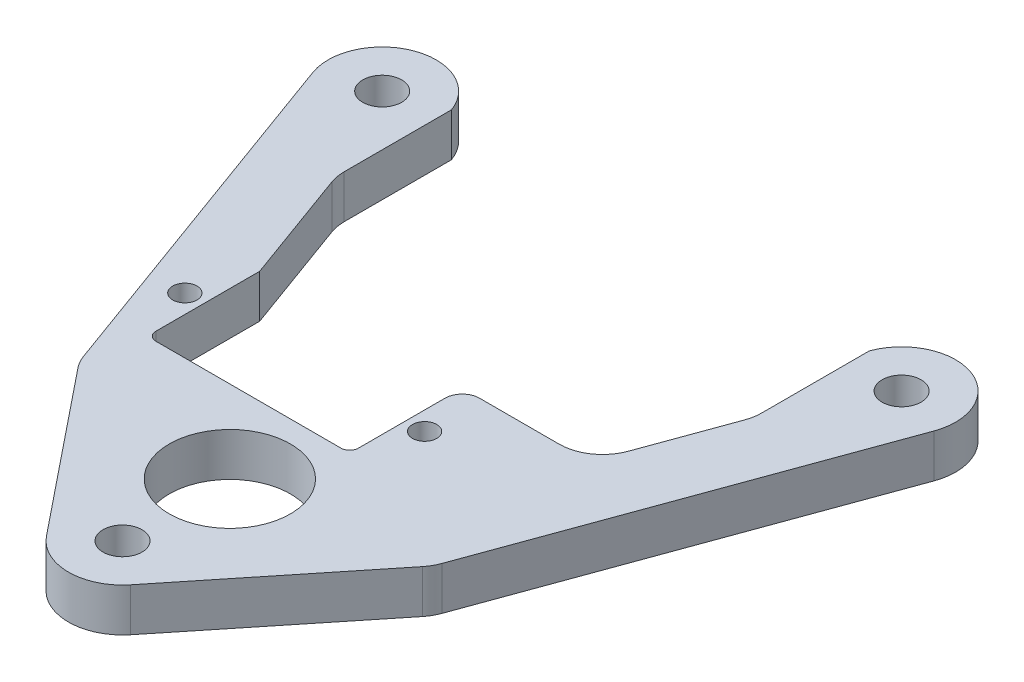
ISO-10303-21;
HEADER;
FILE_DESCRIPTION(('STEP AP214'),'2;1');
FILE_NAME('part.step','',(''),(''),'','','');
FILE_SCHEMA(('AUTOMOTIVE_DESIGN { 1 0 10303 214 1 1 1 1 }'));
ENDSEC;
DATA;
#1=APPLICATION_CONTEXT('core data for automotive mechanical design processes');
#2=APPLICATION_PROTOCOL_DEFINITION('international standard','automotive_design',2000,#1);
#3=PRODUCT_CONTEXT('',#1,'mechanical');
#4=PRODUCT('Part','Part','',(#3));
#5=PRODUCT_RELATED_PRODUCT_CATEGORY('part','',(#4));
#6=PRODUCT_DEFINITION_FORMATION('','',#4);
#7=PRODUCT_DEFINITION_CONTEXT('part definition',#1,'design');
#8=PRODUCT_DEFINITION('design','',#6,#7);
#9=PRODUCT_DEFINITION_SHAPE('','',#8);
#10=(LENGTH_UNIT() NAMED_UNIT(*) SI_UNIT(.MILLI.,.METRE.));
#11=(NAMED_UNIT(*) PLANE_ANGLE_UNIT() SI_UNIT($,.RADIAN.));
#12=(NAMED_UNIT(*) SI_UNIT($,.STERADIAN.) SOLID_ANGLE_UNIT());
#13=UNCERTAINTY_MEASURE_WITH_UNIT(LENGTH_MEASURE(1.E-05),#10,'distance_accuracy_value','');
#14=(GEOMETRIC_REPRESENTATION_CONTEXT(3) GLOBAL_UNCERTAINTY_ASSIGNED_CONTEXT((#13)) GLOBAL_UNIT_ASSIGNED_CONTEXT((#10,
#11,#12)) REPRESENTATION_CONTEXT('',''));
#15=CARTESIAN_POINT('',(0.,0.,0.));
#16=DIRECTION('',(0.,0.,1.));
#17=DIRECTION('',(1.,0.,0.));
#18=AXIS2_PLACEMENT_3D('',#15,#16,#17);
#19=CARTESIAN_POINT('',(0.,5.,28.4));
#20=DIRECTION('',(0.,1.,0.));
#21=DIRECTION('',(0.,0.,1.));
#22=AXIS2_PLACEMENT_3D('',#19,#20,#21);
#23=PLANE('',#22);
#24=CARTESIAN_POINT('',(0.,5.,16.));
#25=DIRECTION('',(0.,1.,0.));
#26=DIRECTION('',(0.,0.,1.));
#27=AXIS2_PLACEMENT_3D('',#24,#25,#26);
#28=CIRCLE('',#27,7.);
#29=CARTESIAN_POINT('',(0.,5.,23.));
#30=VERTEX_POINT('',#29);
#31=EDGE_CURVE('E534',#30,#30,#28,.T.);
#32=ORIENTED_EDGE('',*,*,#31,.F.);
#33=EDGE_LOOP('',(#32));
#34=FACE_BOUND('',#33,.T.);
#35=CARTESIAN_POINT('',(-21.2,5.,0.));
#36=DIRECTION('',(0.,1.,0.));
#37=DIRECTION('',(0.,0.,1.));
#38=AXIS2_PLACEMENT_3D('',#35,#36,#37);
#39=CIRCLE('',#38,1.4);
#40=CARTESIAN_POINT('',(-21.2,5.,1.4));
#41=VERTEX_POINT('',#40);
#42=EDGE_CURVE('E226',#41,#41,#39,.T.);
#43=ORIENTED_EDGE('',*,*,#42,.F.);
#44=EDGE_LOOP('',(#43));
#45=FACE_BOUND('',#44,.T.);
#46=CARTESIAN_POINT('',(6.5,5.,0.));
#47=DIRECTION('',(0.,1.,0.));
#48=DIRECTION('',(0.,0.,1.));
#49=AXIS2_PLACEMENT_3D('',#46,#47,#48);
#50=CIRCLE('',#49,1.4);
#51=CARTESIAN_POINT('',(6.5,5.,1.4));
#52=VERTEX_POINT('',#51);
#53=EDGE_CURVE('E223',#52,#52,#50,.T.);
#54=ORIENTED_EDGE('',*,*,#53,.F.);
#55=EDGE_LOOP('',(#54));
#56=FACE_BOUND('',#55,.T.);
#57=DIRECTION('',(1.,0.,0.));
#58=VECTOR('',#57,1.);
#59=CARTESIAN_POINT('',(0.,5.,-6.50000000000001));
#60=LINE('',#59,#58);
#61=CARTESIAN_POINT('',(6.35,5.,-6.50000000000001));
#62=VERTEX_POINT('',#61);
#63=CARTESIAN_POINT('',(15.5489623089514,5.,-6.50000000000001));
#64=VERTEX_POINT('',#63);
#65=EDGE_CURVE('E197',#62,#64,#60,.T.);
#66=ORIENTED_EDGE('',*,*,#65,.F.);
#67=CARTESIAN_POINT('',(6.35,5.,-4.50000000000001));
#68=DIRECTION('',(0.,1.,0.));
#69=DIRECTION('',(0.,0.,1.));
#70=AXIS2_PLACEMENT_3D('',#67,#68,#69);
#71=CIRCLE('',#70,2.);
#72=CARTESIAN_POINT('',(4.35,5.,-4.5));
#73=VERTEX_POINT('',#72);
#74=EDGE_CURVE('E55',#62,#73,#71,.T.);
#75=ORIENTED_EDGE('',*,*,#74,.T.);
#76=DIRECTION('',(0.,0.,-1.));
#77=VECTOR('',#76,1.);
#78=CARTESIAN_POINT('',(4.35,5.,28.4));
#79=LINE('',#78,#77);
#80=CARTESIAN_POINT('',(4.35,5.,5.5));
#81=VERTEX_POINT('',#80);
#82=EDGE_CURVE('E213',#81,#73,#79,.T.);
#83=ORIENTED_EDGE('',*,*,#82,.F.);
#84=CARTESIAN_POINT('',(3.35,5.,5.5));
#85=DIRECTION('',(0.,1.,0.));
#86=DIRECTION('',(0.,0.,1.));
#87=AXIS2_PLACEMENT_3D('',#84,#85,#86);
#88=CIRCLE('',#87,1.);
#89=CARTESIAN_POINT('',(3.35,5.,6.5));
#90=VERTEX_POINT('',#89);
#91=EDGE_CURVE('E376',#81,#90,#88,.F.);
#92=ORIENTED_EDGE('',*,*,#91,.T.);
#93=DIRECTION('',(1.,0.,0.));
#94=VECTOR('',#93,1.);
#95=CARTESIAN_POINT('',(0.,5.,6.5));
#96=LINE('',#95,#94);
#97=CARTESIAN_POINT('',(-18.05,5.,6.5));
#98=VERTEX_POINT('',#97);
#99=EDGE_CURVE('E215',#98,#90,#96,.T.);
#100=ORIENTED_EDGE('',*,*,#99,.F.);
#101=CARTESIAN_POINT('',(-18.05,5.,5.5));
#102=DIRECTION('',(0.,1.,0.));
#103=DIRECTION('',(0.,0.,1.));
#104=AXIS2_PLACEMENT_3D('',#101,#102,#103);
#105=CIRCLE('',#104,1.);
#106=CARTESIAN_POINT('',(-19.05,5.,5.5));
#107=VERTEX_POINT('',#106);
#108=EDGE_CURVE('E212',#98,#107,#105,.F.);
#109=ORIENTED_EDGE('',*,*,#108,.T.);
#110=DIRECTION('',(0.,0.,1.));
#111=VECTOR('',#110,1.);
#112=CARTESIAN_POINT('',(-19.05,5.,28.4));
#113=LINE('',#112,#111);
#114=CARTESIAN_POINT('',(-19.05,5.,-6.5));
#115=VERTEX_POINT('',#114);
#116=EDGE_CURVE('E204',#115,#107,#113,.T.);
#117=ORIENTED_EDGE('',*,*,#116,.F.);
#118=DIRECTION('',(0.342020143325666,0.,0.939692620785909));
#119=VECTOR('',#118,1.);
#120=CARTESIAN_POINT('',(-5.60492953167826,5.,30.4400275146905));
#121=LINE('',#120,#119);
#122=CARTESIAN_POINT('',(-23.8253842240176,5.,-19.6202603247083));
#123=VERTEX_POINT('',#122);
#124=EDGE_CURVE('E189',#123,#115,#121,.T.);
#125=ORIENTED_EDGE('',*,*,#124,.F.);
#126=CARTESIAN_POINT('',(-19.1269211200881,5.,-21.3303610413367));
#127=DIRECTION('',(0.,1.,0.));
#128=DIRECTION('',(0.,0.,1.));
#129=AXIS2_PLACEMENT_3D('',#126,#127,#128);
#130=CIRCLE('',#129,5.);
#131=CARTESIAN_POINT('',(-24.1269211200881,5.,-21.3303610413367));
#132=VERTEX_POINT('',#131);
#133=EDGE_CURVE('E362',#123,#132,#130,.F.);
#134=ORIENTED_EDGE('',*,*,#133,.T.);
#135=DIRECTION('',(0.,0.,1.));
#136=VECTOR('',#135,1.);
#137=CARTESIAN_POINT('',(-24.1269211200881,5.,0.));
#138=LINE('',#137,#136);
#139=CARTESIAN_POINT('',(-24.1269211200881,5.,-33.7376258957854));
#140=VERTEX_POINT('',#139);
#141=EDGE_CURVE('E198',#140,#132,#138,.T.);
#142=ORIENTED_EDGE('',*,*,#141,.F.);
#143=CARTESIAN_POINT('',(-30.,5.,-31.6));
#144=DIRECTION('',(0.,-1.,0.));
#145=DIRECTION('',(0.,0.,1.));
#146=AXIS2_PLACEMENT_3D('',#143,#144,#145);
#147=CIRCLE('',#146,6.25);
#148=CARTESIAN_POINT('',(-35.8730788799119,5.,-29.4623741042146));
#149=VERTEX_POINT('',#148);
#150=EDGE_CURVE('E256',#149,#140,#147,.T.);
#151=ORIENTED_EDGE('',*,*,#150,.F.);
#152=DIRECTION('',(-0.342020143325666,0.,-0.93969262078591));
#153=VECTOR('',#152,1.);
#154=CARTESIAN_POINT('',(-20.418038629702,5.,13.));
#155=LINE('',#154,#153);
#156=CARTESIAN_POINT('',(-20.7015993572109,5.,12.2209233041251));
#157=VERTEX_POINT('',#156);
#158=EDGE_CURVE('E253',#157,#149,#155,.T.);
#159=ORIENTED_EDGE('',*,*,#158,.F.);
#160=CARTESIAN_POINT('',(-16.0031362532813,5.,10.5108225874968));
#161=DIRECTION('',(0.,1.,0.));
#162=DIRECTION('',(0.,0.,1.));
#163=AXIS2_PLACEMENT_3D('',#160,#161,#162);
#164=CIRCLE('',#163,5.);
#165=CARTESIAN_POINT('',(-19.8982015260731,5.,13.6458611073067));
#166=VERTEX_POINT('',#165);
#167=EDGE_CURVE('E330',#157,#166,#164,.T.);
#168=ORIENTED_EDGE('',*,*,#167,.T.);
#169=DIRECTION('',(-0.627007703961979,0.,-0.779013054558348));
#170=VECTOR('',#169,1.);
#171=CARTESIAN_POINT('',(-20.418038629702,5.,13.));
#172=LINE('',#171,#170);
#173=CARTESIAN_POINT('',(-4.86883159098967,5.,32.3187981497624));
#174=VERTEX_POINT('',#173);
#175=EDGE_CURVE('E255',#174,#166,#172,.T.);
#176=ORIENTED_EDGE('',*,*,#175,.F.);
#177=CARTESIAN_POINT('',(0.,5.,28.4));
#178=DIRECTION('',(0.,1.,0.));
#179=DIRECTION('',(0.,0.,1.));
#180=AXIS2_PLACEMENT_3D('',#177,#178,#179);
#181=CIRCLE('',#180,6.25);
#182=CARTESIAN_POINT('',(4.86883159098967,5.,32.3187981497624));
#183=VERTEX_POINT('',#182);
#184=EDGE_CURVE('E283',#174,#183,#181,.T.);
#185=ORIENTED_EDGE('',*,*,#184,.T.);
#186=DIRECTION('',(0.627007703961979,0.,-0.779013054558348));
#187=VECTOR('',#186,1.);
#188=CARTESIAN_POINT('',(20.418038629702,5.,13.));
#189=LINE('',#188,#187);
#190=CARTESIAN_POINT('',(19.8982015260731,5.,13.6458611073067));
#191=VERTEX_POINT('',#190);
#192=EDGE_CURVE('E286',#183,#191,#189,.T.);
#193=ORIENTED_EDGE('',*,*,#192,.T.);
#194=CARTESIAN_POINT('',(16.0031362532813,5.,10.5108225874968));
#195=DIRECTION('',(0.,1.,0.));
#196=DIRECTION('',(0.,0.,1.));
#197=AXIS2_PLACEMENT_3D('',#194,#195,#196);
#198=CIRCLE('',#197,5.);
#199=CARTESIAN_POINT('',(20.7015993572109,5.,12.2209233041251));
#200=VERTEX_POINT('',#199);
#201=EDGE_CURVE('E332',#191,#200,#198,.T.);
#202=ORIENTED_EDGE('',*,*,#201,.T.);
#203=DIRECTION('',(0.342020143325666,0.,-0.93969262078591));
#204=VECTOR('',#203,1.);
#205=CARTESIAN_POINT('',(20.418038629702,5.,13.));
#206=LINE('',#205,#204);
#207=CARTESIAN_POINT('',(35.8730788799119,5.,-29.4623741042146));
#208=VERTEX_POINT('',#207);
#209=EDGE_CURVE('E289',#200,#208,#206,.T.);
#210=ORIENTED_EDGE('',*,*,#209,.T.);
#211=CARTESIAN_POINT('',(30.,5.,-31.6));
#212=DIRECTION('',(0.,1.,0.));
#213=DIRECTION('',(0.,0.,1.));
#214=AXIS2_PLACEMENT_3D('',#211,#212,#213);
#215=CIRCLE('',#214,6.25);
#216=CARTESIAN_POINT('',(24.1269211200881,5.,-33.7376258957854));
#217=VERTEX_POINT('',#216);
#218=EDGE_CURVE('E291',#208,#217,#215,.T.);
#219=ORIENTED_EDGE('',*,*,#218,.T.);
#220=DIRECTION('',(0.,0.,1.));
#221=VECTOR('',#220,1.);
#222=CARTESIAN_POINT('',(24.1269211200881,5.,28.4));
#223=LINE('',#222,#221);
#224=CARTESIAN_POINT('',(24.1269211200881,5.,-21.3303610413367));
#225=VERTEX_POINT('',#224);
#226=EDGE_CURVE('E235',#217,#225,#223,.T.);
#227=ORIENTED_EDGE('',*,*,#226,.T.);
#228=CARTESIAN_POINT('',(19.1269211200881,5.,-21.3303610413367));
#229=DIRECTION('',(0.,1.,0.));
#230=DIRECTION('',(0.,0.,1.));
#231=AXIS2_PLACEMENT_3D('',#228,#229,#230);
#232=CIRCLE('',#231,5.);
#233=CARTESIAN_POINT('',(23.8253842240176,5.,-19.6202603247083));
#234=VERTEX_POINT('',#233);
#235=EDGE_CURVE('E358',#225,#234,#232,.F.);
#236=ORIENTED_EDGE('',*,*,#235,.T.);
#237=DIRECTION('',(-0.342020143325666,0.,0.939692620785909));
#238=VECTOR('',#237,1.);
#239=CARTESIAN_POINT('',(5.60492953167826,5.,30.4400275146905));
#240=LINE('',#239,#238);
#241=CARTESIAN_POINT('',(20.247425412881,5.,-9.78989928337168));
#242=VERTEX_POINT('',#241);
#243=EDGE_CURVE('E236',#234,#242,#240,.T.);
#244=ORIENTED_EDGE('',*,*,#243,.T.);
#245=CARTESIAN_POINT('',(15.5489623089514,5.,-11.5));
#246=DIRECTION('',(0.,1.,0.));
#247=DIRECTION('',(0.,0.,1.));
#248=AXIS2_PLACEMENT_3D('',#245,#246,#247);
#249=CIRCLE('',#248,5.);
#250=EDGE_CURVE('E353',#242,#64,#249,.F.);
#251=ORIENTED_EDGE('',*,*,#250,.T.);
#252=EDGE_LOOP('',(#66,#75,#83,#92,#100,#109,#117,#125,#134,#142,#151,#159,#168,#176,#185,#193,
#202,#210,#219,#227,#236,#244,#251));
#253=FACE_BOUND('',#252,.T.);
#254=CARTESIAN_POINT('',(0.,5.,28.4));
#255=DIRECTION('',(0.,-1.,0.));
#256=DIRECTION('',(0.,0.,1.));
#257=AXIS2_PLACEMENT_3D('',#254,#255,#256);
#258=CIRCLE('',#257,2.25);
#259=CARTESIAN_POINT('',(0.,5.,30.65));
#260=VERTEX_POINT('',#259);
#261=EDGE_CURVE('E280',#260,#260,#258,.T.);
#262=ORIENTED_EDGE('',*,*,#261,.T.);
#263=EDGE_LOOP('',(#262));
#264=FACE_BOUND('',#263,.T.);
#265=CARTESIAN_POINT('',(30.,5.,-31.6));
#266=DIRECTION('',(0.,1.,0.));
#267=DIRECTION('',(0.,0.,1.));
#268=AXIS2_PLACEMENT_3D('',#265,#266,#267);
#269=CIRCLE('',#268,2.25);
#270=CARTESIAN_POINT('',(30.,5.,-29.35));
#271=VERTEX_POINT('',#270);
#272=EDGE_CURVE('E273',#271,#271,#269,.T.);
#273=ORIENTED_EDGE('',*,*,#272,.F.);
#274=EDGE_LOOP('',(#273));
#275=FACE_BOUND('',#274,.T.);
#276=CARTESIAN_POINT('',(-30.,5.,-31.6));
#277=DIRECTION('',(0.,-1.,0.));
#278=DIRECTION('',(0.,0.,1.));
#279=AXIS2_PLACEMENT_3D('',#276,#277,#278);
#280=CIRCLE('',#279,2.25);
#281=CARTESIAN_POINT('',(-30.,5.,-29.35));
#282=VERTEX_POINT('',#281);
#283=EDGE_CURVE('E247',#282,#282,#280,.T.);
#284=ORIENTED_EDGE('',*,*,#283,.T.);
#285=EDGE_LOOP('',(#284));
#286=FACE_BOUND('',#285,.T.);
#287=ADVANCED_FACE('F33',(#34,#45,#56,#253,#264,#275,#286),#23,.T.);
#288=CARTESIAN_POINT('',(0.,0.,28.4));
#289=DIRECTION('',(0.,1.,0.));
#290=DIRECTION('',(0.,0.,1.));
#291=AXIS2_PLACEMENT_3D('',#288,#289,#290);
#292=PLANE('',#291);
#293=CARTESIAN_POINT('',(0.,0.,16.));
#294=DIRECTION('',(0.,1.,0.));
#295=DIRECTION('',(0.,0.,1.));
#296=AXIS2_PLACEMENT_3D('',#293,#294,#295);
#297=CIRCLE('',#296,7.);
#298=CARTESIAN_POINT('',(0.,0.,23.));
#299=VERTEX_POINT('',#298);
#300=EDGE_CURVE('E532',#299,#299,#297,.T.);
#301=ORIENTED_EDGE('',*,*,#300,.T.);
#302=EDGE_LOOP('',(#301));
#303=FACE_BOUND('',#302,.T.);
#304=CARTESIAN_POINT('',(-21.2,0.,0.));
#305=DIRECTION('',(0.,1.,0.));
#306=DIRECTION('',(0.,0.,1.));
#307=AXIS2_PLACEMENT_3D('',#304,#305,#306);
#308=CIRCLE('',#307,1.4);
#309=CARTESIAN_POINT('',(-21.2,0.,1.4));
#310=VERTEX_POINT('',#309);
#311=EDGE_CURVE('E528',#310,#310,#308,.T.);
#312=ORIENTED_EDGE('',*,*,#311,.T.);
#313=EDGE_LOOP('',(#312));
#314=FACE_BOUND('',#313,.T.);
#315=CARTESIAN_POINT('',(6.5,0.,0.));
#316=DIRECTION('',(0.,1.,0.));
#317=DIRECTION('',(0.,0.,1.));
#318=AXIS2_PLACEMENT_3D('',#315,#316,#317);
#319=CIRCLE('',#318,1.4);
#320=CARTESIAN_POINT('',(6.5,0.,1.4));
#321=VERTEX_POINT('',#320);
#322=EDGE_CURVE('E525',#321,#321,#319,.T.);
#323=ORIENTED_EDGE('',*,*,#322,.T.);
#324=EDGE_LOOP('',(#323));
#325=FACE_BOUND('',#324,.T.);
#326=CARTESIAN_POINT('',(-30.,0.,-31.6));
#327=DIRECTION('',(0.,-1.,0.));
#328=DIRECTION('',(0.,0.,1.));
#329=AXIS2_PLACEMENT_3D('',#326,#327,#328);
#330=CIRCLE('',#329,2.25);
#331=CARTESIAN_POINT('',(-30.,0.,-29.35));
#332=VERTEX_POINT('',#331);
#333=EDGE_CURVE('E246',#332,#332,#330,.T.);
#334=ORIENTED_EDGE('',*,*,#333,.F.);
#335=EDGE_LOOP('',(#334));
#336=FACE_BOUND('',#335,.T.);
#337=CARTESIAN_POINT('',(30.,0.,-31.6));
#338=DIRECTION('',(0.,1.,0.));
#339=DIRECTION('',(0.,0.,1.));
#340=AXIS2_PLACEMENT_3D('',#337,#338,#339);
#341=CIRCLE('',#340,2.25);
#342=CARTESIAN_POINT('',(30.,0.,-29.35));
#343=VERTEX_POINT('',#342);
#344=EDGE_CURVE('E277',#343,#343,#341,.T.);
#345=ORIENTED_EDGE('',*,*,#344,.T.);
#346=EDGE_LOOP('',(#345));
#347=FACE_BOUND('',#346,.T.);
#348=CARTESIAN_POINT('',(0.,0.,28.4));
#349=DIRECTION('',(0.,-1.,0.));
#350=DIRECTION('',(0.,0.,1.));
#351=AXIS2_PLACEMENT_3D('',#348,#349,#350);
#352=CIRCLE('',#351,2.25);
#353=CARTESIAN_POINT('',(0.,0.,30.65));
#354=VERTEX_POINT('',#353);
#355=EDGE_CURVE('E276',#354,#354,#352,.T.);
#356=ORIENTED_EDGE('',*,*,#355,.F.);
#357=EDGE_LOOP('',(#356));
#358=FACE_BOUND('',#357,.T.);
#359=DIRECTION('',(0.,0.,-1.));
#360=VECTOR('',#359,1.);
#361=CARTESIAN_POINT('',(4.35,0.,6.5));
#362=LINE('',#361,#360);
#363=CARTESIAN_POINT('',(4.35,0.,5.5));
#364=VERTEX_POINT('',#363);
#365=CARTESIAN_POINT('',(4.35,0.,-4.5));
#366=VERTEX_POINT('',#365);
#367=EDGE_CURVE('E217',#364,#366,#362,.T.);
#368=ORIENTED_EDGE('',*,*,#367,.T.);
#369=CARTESIAN_POINT('',(6.35,0.,-4.50000000000001));
#370=DIRECTION('',(0.,1.,0.));
#371=DIRECTION('',(0.,0.,1.));
#372=AXIS2_PLACEMENT_3D('',#369,#370,#371);
#373=CIRCLE('',#372,2.);
#374=CARTESIAN_POINT('',(6.35,0.,-6.50000000000001));
#375=VERTEX_POINT('',#374);
#376=EDGE_CURVE('E11',#366,#375,#373,.F.);
#377=ORIENTED_EDGE('',*,*,#376,.T.);
#378=DIRECTION('',(1.,0.,0.));
#379=VECTOR('',#378,1.);
#380=CARTESIAN_POINT('',(0.,0.,-6.50000000000001));
#381=LINE('',#380,#379);
#382=CARTESIAN_POINT('',(15.5489623089514,0.,-6.50000000000001));
#383=VERTEX_POINT('',#382);
#384=EDGE_CURVE('E239',#375,#383,#381,.T.);
#385=ORIENTED_EDGE('',*,*,#384,.T.);
#386=CARTESIAN_POINT('',(15.5489623089514,0.,-11.5));
#387=DIRECTION('',(0.,1.,0.));
#388=DIRECTION('',(0.,0.,1.));
#389=AXIS2_PLACEMENT_3D('',#386,#387,#388);
#390=CIRCLE('',#389,5.);
#391=CARTESIAN_POINT('',(20.247425412881,0.,-9.78989928337168));
#392=VERTEX_POINT('',#391);
#393=EDGE_CURVE('E356',#383,#392,#390,.T.);
#394=ORIENTED_EDGE('',*,*,#393,.T.);
#395=DIRECTION('',(-0.342020143325666,0.,0.939692620785909));
#396=VECTOR('',#395,1.);
#397=CARTESIAN_POINT('',(14.7325135892271,0.,5.36219642240094));
#398=LINE('',#397,#396);
#399=CARTESIAN_POINT('',(23.8253842240176,0.,-19.6202603247083));
#400=VERTEX_POINT('',#399);
#401=EDGE_CURVE('E229',#400,#392,#398,.T.);
#402=ORIENTED_EDGE('',*,*,#401,.F.);
#403=CARTESIAN_POINT('',(19.1269211200881,0.,-21.3303610413367));
#404=DIRECTION('',(0.,1.,0.));
#405=DIRECTION('',(0.,0.,1.));
#406=AXIS2_PLACEMENT_3D('',#403,#404,#405);
#407=CIRCLE('',#406,5.);
#408=CARTESIAN_POINT('',(24.1269211200881,0.,-21.3303610413367));
#409=VERTEX_POINT('',#408);
#410=EDGE_CURVE('E360',#400,#409,#407,.T.);
#411=ORIENTED_EDGE('',*,*,#410,.T.);
#412=DIRECTION('',(0.,0.,1.));
#413=VECTOR('',#412,1.);
#414=CARTESIAN_POINT('',(24.1269211200881,0.,0.));
#415=LINE('',#414,#413);
#416=CARTESIAN_POINT('',(24.1269211200881,0.,-33.7376258957854));
#417=VERTEX_POINT('',#416);
#418=EDGE_CURVE('E232',#417,#409,#415,.T.);
#419=ORIENTED_EDGE('',*,*,#418,.F.);
#420=CARTESIAN_POINT('',(30.,0.,-31.6));
#421=DIRECTION('',(0.,1.,0.));
#422=DIRECTION('',(0.,0.,1.));
#423=AXIS2_PLACEMENT_3D('',#420,#421,#422);
#424=CIRCLE('',#423,6.25);
#425=CARTESIAN_POINT('',(35.8730788799119,0.,-29.4623741042146));
#426=VERTEX_POINT('',#425);
#427=EDGE_CURVE('E284',#426,#417,#424,.T.);
#428=ORIENTED_EDGE('',*,*,#427,.F.);
#429=DIRECTION('',(0.342020143325666,0.,-0.93969262078591));
#430=VECTOR('',#429,1.);
#431=CARTESIAN_POINT('',(20.418038629702,0.,13.));
#432=LINE('',#431,#430);
#433=CARTESIAN_POINT('',(20.7015993572109,0.,12.2209233041251));
#434=VERTEX_POINT('',#433);
#435=EDGE_CURVE('E299',#434,#426,#432,.T.);
#436=ORIENTED_EDGE('',*,*,#435,.F.);
#437=CARTESIAN_POINT('',(16.0031362532813,0.,10.5108225874968));
#438=DIRECTION('',(0.,1.,0.));
#439=DIRECTION('',(0.,0.,1.));
#440=AXIS2_PLACEMENT_3D('',#437,#438,#439);
#441=CIRCLE('',#440,5.);
#442=CARTESIAN_POINT('',(19.8982015260731,0.,13.6458611073067));
#443=VERTEX_POINT('',#442);
#444=EDGE_CURVE('E326',#434,#443,#441,.F.);
#445=ORIENTED_EDGE('',*,*,#444,.T.);
#446=DIRECTION('',(0.627007703961979,0.,-0.779013054558348));
#447=VECTOR('',#446,1.);
#448=CARTESIAN_POINT('',(20.418038629702,0.,13.));
#449=LINE('',#448,#447);
#450=CARTESIAN_POINT('',(4.86883159098967,0.,32.3187981497624));
#451=VERTEX_POINT('',#450);
#452=EDGE_CURVE('E296',#451,#443,#449,.T.);
#453=ORIENTED_EDGE('',*,*,#452,.F.);
#454=CARTESIAN_POINT('',(0.,0.,28.4));
#455=DIRECTION('',(0.,1.,0.));
#456=DIRECTION('',(0.,0.,1.));
#457=AXIS2_PLACEMENT_3D('',#454,#455,#456);
#458=CIRCLE('',#457,6.25);
#459=CARTESIAN_POINT('',(-4.86883159098967,0.,32.3187981497624));
#460=VERTEX_POINT('',#459);
#461=EDGE_CURVE('E294',#460,#451,#458,.T.);
#462=ORIENTED_EDGE('',*,*,#461,.F.);
#463=DIRECTION('',(-0.627007703961979,0.,-0.779013054558348));
#464=VECTOR('',#463,1.);
#465=CARTESIAN_POINT('',(-20.418038629702,0.,13.));
#466=LINE('',#465,#464);
#467=CARTESIAN_POINT('',(-19.8982015260731,0.,13.6458611073067));
#468=VERTEX_POINT('',#467);
#469=EDGE_CURVE('E264',#460,#468,#466,.T.);
#470=ORIENTED_EDGE('',*,*,#469,.T.);
#471=CARTESIAN_POINT('',(-16.0031362532813,0.,10.5108225874968));
#472=DIRECTION('',(0.,1.,0.));
#473=DIRECTION('',(0.,0.,1.));
#474=AXIS2_PLACEMENT_3D('',#471,#472,#473);
#475=CIRCLE('',#474,5.);
#476=CARTESIAN_POINT('',(-20.7015993572109,0.,12.2209233041251));
#477=VERTEX_POINT('',#476);
#478=EDGE_CURVE('E324',#468,#477,#475,.F.);
#479=ORIENTED_EDGE('',*,*,#478,.T.);
#480=DIRECTION('',(-0.342020143325666,0.,-0.93969262078591));
#481=VECTOR('',#480,1.);
#482=CARTESIAN_POINT('',(-20.418038629702,0.,13.));
#483=LINE('',#482,#481);
#484=CARTESIAN_POINT('',(-35.8730788799119,0.,-29.4623741042146));
#485=VERTEX_POINT('',#484);
#486=EDGE_CURVE('E262',#477,#485,#483,.T.);
#487=ORIENTED_EDGE('',*,*,#486,.T.);
#488=CARTESIAN_POINT('',(-30.,0.,-31.6));
#489=DIRECTION('',(0.,-1.,0.));
#490=DIRECTION('',(0.,0.,1.));
#491=AXIS2_PLACEMENT_3D('',#488,#489,#490);
#492=CIRCLE('',#491,6.25);
#493=CARTESIAN_POINT('',(-24.1269211200881,0.,-33.7376258957854));
#494=VERTEX_POINT('',#493);
#495=EDGE_CURVE('E250',#485,#494,#492,.T.);
#496=ORIENTED_EDGE('',*,*,#495,.T.);
#497=DIRECTION('',(0.,0.,1.));
#498=VECTOR('',#497,1.);
#499=CARTESIAN_POINT('',(-24.1269211200881,0.,0.));
#500=LINE('',#499,#498);
#501=CARTESIAN_POINT('',(-24.1269211200881,0.,-21.3303610413367));
#502=VERTEX_POINT('',#501);
#503=EDGE_CURVE('E241',#494,#502,#500,.T.);
#504=ORIENTED_EDGE('',*,*,#503,.T.);
#505=CARTESIAN_POINT('',(-19.1269211200881,0.,-21.3303610413367));
#506=DIRECTION('',(0.,1.,0.));
#507=DIRECTION('',(0.,0.,1.));
#508=AXIS2_PLACEMENT_3D('',#505,#506,#507);
#509=CIRCLE('',#508,5.);
#510=CARTESIAN_POINT('',(-23.8253842240176,0.,-19.6202603247083));
#511=VERTEX_POINT('',#510);
#512=EDGE_CURVE('E364',#502,#511,#509,.T.);
#513=ORIENTED_EDGE('',*,*,#512,.T.);
#514=DIRECTION('',(0.342020143325666,0.,0.939692620785909));
#515=VECTOR('',#514,1.);
#516=CARTESIAN_POINT('',(-14.7325135892271,0.,5.36219642240094));
#517=LINE('',#516,#515);
#518=CARTESIAN_POINT('',(-19.05,0.,-6.5));
#519=VERTEX_POINT('',#518);
#520=EDGE_CURVE('E208',#511,#519,#517,.T.);
#521=ORIENTED_EDGE('',*,*,#520,.T.);
#522=DIRECTION('',(0.,0.,1.));
#523=VECTOR('',#522,1.);
#524=CARTESIAN_POINT('',(-19.05,0.,6.5));
#525=LINE('',#524,#523);
#526=CARTESIAN_POINT('',(-19.05,0.,5.5));
#527=VERTEX_POINT('',#526);
#528=EDGE_CURVE('E207',#519,#527,#525,.T.);
#529=ORIENTED_EDGE('',*,*,#528,.T.);
#530=CARTESIAN_POINT('',(-18.05,0.,5.5));
#531=DIRECTION('',(0.,1.,0.));
#532=DIRECTION('',(0.,0.,1.));
#533=AXIS2_PLACEMENT_3D('',#530,#531,#532);
#534=CIRCLE('',#533,1.);
#535=CARTESIAN_POINT('',(-18.05,0.,6.5));
#536=VERTEX_POINT('',#535);
#537=EDGE_CURVE('E381',#527,#536,#534,.T.);
#538=ORIENTED_EDGE('',*,*,#537,.T.);
#539=DIRECTION('',(1.,0.,0.));
#540=VECTOR('',#539,1.);
#541=CARTESIAN_POINT('',(4.35,0.,6.5));
#542=LINE('',#541,#540);
#543=CARTESIAN_POINT('',(3.35,0.,6.5));
#544=VERTEX_POINT('',#543);
#545=EDGE_CURVE('E520',#536,#544,#542,.T.);
#546=ORIENTED_EDGE('',*,*,#545,.T.);
#547=CARTESIAN_POINT('',(3.35,0.,5.5));
#548=DIRECTION('',(0.,1.,0.));
#549=DIRECTION('',(0.,0.,1.));
#550=AXIS2_PLACEMENT_3D('',#547,#548,#549);
#551=CIRCLE('',#550,1.);
#552=EDGE_CURVE('E378',#544,#364,#551,.T.);
#553=ORIENTED_EDGE('',*,*,#552,.T.);
#554=EDGE_LOOP('',(#368,#377,#385,#394,#402,#411,#419,#428,#436,#445,#453,#462,#470,#479,#487,
#496,#504,#513,#521,#529,#538,#546,#553));
#555=FACE_BOUND('',#554,.T.);
#556=ADVANCED_FACE('F400',(#303,#314,#325,#336,#347,#358,#555),#292,.F.);
#557=CARTESIAN_POINT('',(0.,5.,28.4));
#558=DIRECTION('',(0.,-1.,0.));
#559=DIRECTION('',(0.,0.,-1.));
#560=AXIS2_PLACEMENT_3D('',#557,#558,#559);
#561=CYLINDRICAL_SURFACE('',#560,2.25);
#562=ORIENTED_EDGE('',*,*,#355,.T.);
#563=EDGE_LOOP('',(#562));
#564=FACE_BOUND('',#563,.T.);
#565=ORIENTED_EDGE('',*,*,#261,.F.);
#566=EDGE_LOOP('',(#565));
#567=FACE_BOUND('',#566,.T.);
#568=ADVANCED_FACE('F475',(#564,#567),#561,.F.);
#569=CARTESIAN_POINT('',(0.,5.,28.4));
#570=DIRECTION('',(0.,-1.,0.));
#571=DIRECTION('',(0.,0.,-1.));
#572=AXIS2_PLACEMENT_3D('',#569,#570,#571);
#573=CYLINDRICAL_SURFACE('',#572,6.25);
#574=ORIENTED_EDGE('',*,*,#461,.T.);
#575=DIRECTION('',(0.,-1.,0.));
#576=VECTOR('',#575,1.);
#577=CARTESIAN_POINT('',(4.86883159098967,5.,32.3187981497624));
#578=LINE('',#577,#576);
#579=EDGE_CURVE('E306',#183,#451,#578,.T.);
#580=ORIENTED_EDGE('',*,*,#579,.F.);
#581=ORIENTED_EDGE('',*,*,#184,.F.);
#582=DIRECTION('',(0.,-1.,0.));
#583=VECTOR('',#582,1.);
#584=CARTESIAN_POINT('',(-4.86883159098967,5.,32.3187981497624));
#585=LINE('',#584,#583);
#586=EDGE_CURVE('E259',#174,#460,#585,.T.);
#587=ORIENTED_EDGE('',*,*,#586,.T.);
#588=EDGE_LOOP('',(#574,#580,#581,#587));
#589=FACE_BOUND('',#588,.T.);
#590=ADVANCED_FACE('F434',(#589),#573,.T.);
#591=CARTESIAN_POINT('',(20.418038629702,5.,13.));
#592=DIRECTION('',(-0.779013054558348,0.,-0.627007703961979));
#593=DIRECTION('',(-0.627007703961979,0.,0.779013054558348));
#594=AXIS2_PLACEMENT_3D('',#591,#592,#593);
#595=PLANE('',#594);
#596=ORIENTED_EDGE('',*,*,#452,.T.);
#597=DIRECTION('',(0.,-1.,0.));
#598=VECTOR('',#597,1.);
#599=CARTESIAN_POINT('',(19.8982015260731,5.,13.6458611073067));
#600=LINE('',#599,#598);
#601=EDGE_CURVE('E328',#443,#191,#600,.F.);
#602=ORIENTED_EDGE('',*,*,#601,.T.);
#603=ORIENTED_EDGE('',*,*,#192,.F.);
#604=ORIENTED_EDGE('',*,*,#579,.T.);
#605=EDGE_LOOP('',(#596,#602,#603,#604));
#606=FACE_BOUND('',#605,.T.);
#607=ADVANCED_FACE('F429',(#606),#595,.F.);
#608=CARTESIAN_POINT('',(20.418038629702,5.,13.));
#609=DIRECTION('',(-0.93969262078591,0.,-0.342020143325666));
#610=DIRECTION('',(-0.342020143325666,0.,0.93969262078591));
#611=AXIS2_PLACEMENT_3D('',#608,#609,#610);
#612=PLANE('',#611);
#613=ORIENTED_EDGE('',*,*,#209,.F.);
#614=DIRECTION('',(0.,-1.,0.));
#615=VECTOR('',#614,1.);
#616=CARTESIAN_POINT('',(20.7015993572109,5.,12.2209233041251));
#617=LINE('',#616,#615);
#618=EDGE_CURVE('E310',#200,#434,#617,.T.);
#619=ORIENTED_EDGE('',*,*,#618,.T.);
#620=ORIENTED_EDGE('',*,*,#435,.T.);
#621=DIRECTION('',(0.,-1.,0.));
#622=VECTOR('',#621,1.);
#623=CARTESIAN_POINT('',(35.8730788799119,5.,-29.4623741042146));
#624=LINE('',#623,#622);
#625=EDGE_CURVE('E303',#208,#426,#624,.T.);
#626=ORIENTED_EDGE('',*,*,#625,.F.);
#627=EDGE_LOOP('',(#613,#619,#620,#626));
#628=FACE_BOUND('',#627,.T.);
#629=ADVANCED_FACE('F421',(#628),#612,.F.);
#630=CARTESIAN_POINT('',(30.,5.,-31.6));
#631=DIRECTION('',(0.,-1.,0.));
#632=DIRECTION('',(0.,0.,-1.));
#633=AXIS2_PLACEMENT_3D('',#630,#631,#632);
#634=CYLINDRICAL_SURFACE('',#633,6.25);
#635=ORIENTED_EDGE('',*,*,#427,.T.);
#636=DIRECTION('',(0.,-1.,0.));
#637=VECTOR('',#636,1.);
#638=CARTESIAN_POINT('',(24.1269211200881,5.,-33.7376258957854));
#639=LINE('',#638,#637);
#640=EDGE_CURVE('E307',#217,#417,#639,.T.);
#641=ORIENTED_EDGE('',*,*,#640,.F.);
#642=ORIENTED_EDGE('',*,*,#218,.F.);
#643=ORIENTED_EDGE('',*,*,#625,.T.);
#644=EDGE_LOOP('',(#635,#641,#642,#643));
#645=FACE_BOUND('',#644,.T.);
#646=ADVANCED_FACE('F415',(#645),#634,.T.);
#647=CARTESIAN_POINT('',(30.,5.,-31.6));
#648=DIRECTION('',(0.,-1.,0.));
#649=DIRECTION('',(0.,0.,-1.));
#650=AXIS2_PLACEMENT_3D('',#647,#648,#649);
#651=CYLINDRICAL_SURFACE('',#650,2.25);
#652=ORIENTED_EDGE('',*,*,#272,.T.);
#653=EDGE_LOOP('',(#652));
#654=FACE_BOUND('',#653,.T.);
#655=ORIENTED_EDGE('',*,*,#344,.F.);
#656=EDGE_LOOP('',(#655));
#657=FACE_BOUND('',#656,.T.);
#658=ADVANCED_FACE('F481',(#654,#657),#651,.F.);
#659=CARTESIAN_POINT('',(-30.,5.,-31.6));
#660=DIRECTION('',(0.,-1.,0.));
#661=DIRECTION('',(0.,0.,-1.));
#662=AXIS2_PLACEMENT_3D('',#659,#660,#661);
#663=CYLINDRICAL_SURFACE('',#662,6.25);
#664=ORIENTED_EDGE('',*,*,#495,.F.);
#665=DIRECTION('',(0.,-1.,0.));
#666=VECTOR('',#665,1.);
#667=CARTESIAN_POINT('',(-35.8730788799119,5.,-29.4623741042146));
#668=LINE('',#667,#666);
#669=EDGE_CURVE('E269',#149,#485,#668,.T.);
#670=ORIENTED_EDGE('',*,*,#669,.F.);
#671=ORIENTED_EDGE('',*,*,#150,.T.);
#672=DIRECTION('',(0.,-1.,0.));
#673=VECTOR('',#672,1.);
#674=CARTESIAN_POINT('',(-24.1269211200881,5.,-33.7376258957854));
#675=LINE('',#674,#673);
#676=EDGE_CURVE('E272',#140,#494,#675,.T.);
#677=ORIENTED_EDGE('',*,*,#676,.T.);
#678=EDGE_LOOP('',(#664,#670,#671,#677));
#679=FACE_BOUND('',#678,.T.);
#680=ADVANCED_FACE('F451',(#679),#663,.T.);
#681=CARTESIAN_POINT('',(-20.418038629702,5.,13.));
#682=DIRECTION('',(-0.93969262078591,0.,0.342020143325666));
#683=DIRECTION('',(0.342020143325666,0.,0.93969262078591));
#684=AXIS2_PLACEMENT_3D('',#681,#682,#683);
#685=PLANE('',#684);
#686=ORIENTED_EDGE('',*,*,#486,.F.);
#687=DIRECTION('',(0.,-1.,0.));
#688=VECTOR('',#687,1.);
#689=CARTESIAN_POINT('',(-20.7015993572109,5.,12.2209233041251));
#690=LINE('',#689,#688);
#691=EDGE_CURVE('E337',#477,#157,#690,.F.);
#692=ORIENTED_EDGE('',*,*,#691,.T.);
#693=ORIENTED_EDGE('',*,*,#158,.T.);
#694=ORIENTED_EDGE('',*,*,#669,.T.);
#695=EDGE_LOOP('',(#686,#692,#693,#694));
#696=FACE_BOUND('',#695,.T.);
#697=ADVANCED_FACE('F445',(#696),#685,.T.);
#698=CARTESIAN_POINT('',(-20.418038629702,5.,13.));
#699=DIRECTION('',(-0.779013054558348,0.,0.627007703961979));
#700=DIRECTION('',(0.627007703961979,0.,0.779013054558348));
#701=AXIS2_PLACEMENT_3D('',#698,#699,#700);
#702=PLANE('',#701);
#703=ORIENTED_EDGE('',*,*,#175,.T.);
#704=DIRECTION('',(0.,-1.,0.));
#705=VECTOR('',#704,1.);
#706=CARTESIAN_POINT('',(-19.8982015260731,5.,13.6458611073067));
#707=LINE('',#706,#705);
#708=EDGE_CURVE('E334',#166,#468,#707,.T.);
#709=ORIENTED_EDGE('',*,*,#708,.T.);
#710=ORIENTED_EDGE('',*,*,#469,.F.);
#711=ORIENTED_EDGE('',*,*,#586,.F.);
#712=EDGE_LOOP('',(#703,#709,#710,#711));
#713=FACE_BOUND('',#712,.T.);
#714=ADVANCED_FACE('F437',(#713),#702,.T.);
#715=CARTESIAN_POINT('',(-30.,5.,-31.6));
#716=DIRECTION('',(0.,-1.,0.));
#717=DIRECTION('',(0.,0.,-1.));
#718=AXIS2_PLACEMENT_3D('',#715,#716,#717);
#719=CYLINDRICAL_SURFACE('',#718,2.25);
#720=ORIENTED_EDGE('',*,*,#283,.F.);
#721=EDGE_LOOP('',(#720));
#722=FACE_BOUND('',#721,.T.);
#723=ORIENTED_EDGE('',*,*,#333,.T.);
#724=EDGE_LOOP('',(#723));
#725=FACE_BOUND('',#724,.T.);
#726=ADVANCED_FACE('F625',(#722,#725),#719,.F.);
#727=CARTESIAN_POINT('',(0.,0.,-6.50000000000001));
#728=DIRECTION('',(0.,0.,1.));
#729=DIRECTION('',(1.,0.,0.));
#730=AXIS2_PLACEMENT_3D('',#727,#728,#729);
#731=PLANE('',#730);
#732=ORIENTED_EDGE('',*,*,#384,.F.);
#733=DIRECTION('',(0.,1.,0.));
#734=VECTOR('',#733,1.);
#735=CARTESIAN_POINT('',(6.35,0.,-6.50000000000001));
#736=LINE('',#735,#734);
#737=EDGE_CURVE('E383',#375,#62,#736,.T.);
#738=ORIENTED_EDGE('',*,*,#737,.T.);
#739=ORIENTED_EDGE('',*,*,#65,.T.);
#740=DIRECTION('',(0.,1.,0.));
#741=VECTOR('',#740,1.);
#742=CARTESIAN_POINT('',(15.5489623089514,0.,-6.50000000000001));
#743=LINE('',#742,#741);
#744=EDGE_CURVE('E344',#64,#383,#743,.F.);
#745=ORIENTED_EDGE('',*,*,#744,.T.);
#746=EDGE_LOOP('',(#732,#738,#739,#745));
#747=FACE_BOUND('',#746,.T.);
#748=ADVANCED_FACE('F389',(#747),#731,.F.);
#749=CARTESIAN_POINT('',(-14.7325135892271,0.,5.36219642240094));
#750=DIRECTION('',(-0.939692620785909,0.,0.342020143325666));
#751=DIRECTION('',(0.342020143325666,0.,0.939692620785909));
#752=AXIS2_PLACEMENT_3D('',#749,#750,#751);
#753=PLANE('',#752);
#754=ORIENTED_EDGE('',*,*,#520,.F.);
#755=DIRECTION('',(0.,1.,0.));
#756=VECTOR('',#755,1.);
#757=CARTESIAN_POINT('',(-23.8253842240176,5.,-19.6202603247083));
#758=LINE('',#757,#756);
#759=EDGE_CURVE('E195',#511,#123,#758,.T.);
#760=ORIENTED_EDGE('',*,*,#759,.T.);
#761=ORIENTED_EDGE('',*,*,#124,.T.);
#762=DIRECTION('',(0.,1.,0.));
#763=VECTOR('',#762,1.);
#764=CARTESIAN_POINT('',(-19.05,0.,-6.5));
#765=LINE('',#764,#763);
#766=EDGE_CURVE('E193',#519,#115,#765,.T.);
#767=ORIENTED_EDGE('',*,*,#766,.F.);
#768=EDGE_LOOP('',(#754,#760,#761,#767));
#769=FACE_BOUND('',#768,.T.);
#770=ADVANCED_FACE('F192',(#769),#753,.F.);
#771=CARTESIAN_POINT('',(-24.1269211200881,0.,0.));
#772=DIRECTION('',(-1.,0.,0.));
#773=DIRECTION('',(0.,0.,1.));
#774=AXIS2_PLACEMENT_3D('',#771,#772,#773);
#775=PLANE('',#774);
#776=ORIENTED_EDGE('',*,*,#141,.T.);
#777=DIRECTION('',(0.,1.,0.));
#778=VECTOR('',#777,1.);
#779=CARTESIAN_POINT('',(-24.1269211200881,0.,-21.3303610413367));
#780=LINE('',#779,#778);
#781=EDGE_CURVE('E351',#132,#502,#780,.F.);
#782=ORIENTED_EDGE('',*,*,#781,.T.);
#783=ORIENTED_EDGE('',*,*,#503,.F.);
#784=ORIENTED_EDGE('',*,*,#676,.F.);
#785=EDGE_LOOP('',(#776,#782,#783,#784));
#786=FACE_BOUND('',#785,.T.);
#787=ADVANCED_FACE('F458',(#786),#775,.F.);
#788=CARTESIAN_POINT('',(24.1269211200881,0.,0.));
#789=DIRECTION('',(-1.,0.,0.));
#790=DIRECTION('',(0.,0.,1.));
#791=AXIS2_PLACEMENT_3D('',#788,#789,#790);
#792=PLANE('',#791);
#793=ORIENTED_EDGE('',*,*,#418,.T.);
#794=DIRECTION('',(0.,1.,0.));
#795=VECTOR('',#794,1.);
#796=CARTESIAN_POINT('',(24.1269211200881,5.,-21.3303610413367));
#797=LINE('',#796,#795);
#798=EDGE_CURVE('E347',#409,#225,#797,.T.);
#799=ORIENTED_EDGE('',*,*,#798,.T.);
#800=ORIENTED_EDGE('',*,*,#226,.F.);
#801=ORIENTED_EDGE('',*,*,#640,.T.);
#802=EDGE_LOOP('',(#793,#799,#800,#801));
#803=FACE_BOUND('',#802,.T.);
#804=ADVANCED_FACE('F411',(#803),#792,.T.);
#805=CARTESIAN_POINT('',(14.7325135892271,0.,5.36219642240094));
#806=DIRECTION('',(-0.939692620785909,0.,-0.342020143325666));
#807=DIRECTION('',(-0.342020143325666,0.,0.939692620785909));
#808=AXIS2_PLACEMENT_3D('',#805,#806,#807);
#809=PLANE('',#808);
#810=ORIENTED_EDGE('',*,*,#401,.T.);
#811=DIRECTION('',(0.,1.,0.));
#812=VECTOR('',#811,1.);
#813=CARTESIAN_POINT('',(20.247425412881,0.,-9.78989928337168));
#814=LINE('',#813,#812);
#815=EDGE_CURVE('E341',#392,#242,#814,.T.);
#816=ORIENTED_EDGE('',*,*,#815,.T.);
#817=ORIENTED_EDGE('',*,*,#243,.F.);
#818=DIRECTION('',(0.,1.,0.));
#819=VECTOR('',#818,1.);
#820=CARTESIAN_POINT('',(23.8253842240176,0.,-19.6202603247083));
#821=LINE('',#820,#819);
#822=EDGE_CURVE('E339',#234,#400,#821,.F.);
#823=ORIENTED_EDGE('',*,*,#822,.T.);
#824=EDGE_LOOP('',(#810,#816,#817,#823));
#825=FACE_BOUND('',#824,.T.);
#826=ADVANCED_FACE('F403',(#825),#809,.T.);
#827=CARTESIAN_POINT('',(4.35,0.,6.5));
#828=DIRECTION('',(0.,0.,1.));
#829=DIRECTION('',(1.,0.,0.));
#830=AXIS2_PLACEMENT_3D('',#827,#828,#829);
#831=PLANE('',#830);
#832=ORIENTED_EDGE('',*,*,#99,.T.);
#833=DIRECTION('',(0.,1.,0.));
#834=VECTOR('',#833,1.);
#835=CARTESIAN_POINT('',(3.35,0.,6.5));
#836=LINE('',#835,#834);
#837=EDGE_CURVE('E372',#90,#544,#836,.F.);
#838=ORIENTED_EDGE('',*,*,#837,.T.);
#839=ORIENTED_EDGE('',*,*,#545,.F.);
#840=DIRECTION('',(0.,1.,0.));
#841=VECTOR('',#840,1.);
#842=CARTESIAN_POINT('',(-18.05,5.,6.5));
#843=LINE('',#842,#841);
#844=EDGE_CURVE('E369',#536,#98,#843,.T.);
#845=ORIENTED_EDGE('',*,*,#844,.T.);
#846=EDGE_LOOP('',(#832,#838,#839,#845));
#847=FACE_BOUND('',#846,.T.);
#848=ADVANCED_FACE('F523',(#847),#831,.F.);
#849=CARTESIAN_POINT('',(-19.05,0.,6.5));
#850=DIRECTION('',(-1.,0.,0.));
#851=DIRECTION('',(0.,0.,1.));
#852=AXIS2_PLACEMENT_3D('',#849,#850,#851);
#853=PLANE('',#852);
#854=ORIENTED_EDGE('',*,*,#116,.T.);
#855=DIRECTION('',(0.,1.,0.));
#856=VECTOR('',#855,1.);
#857=CARTESIAN_POINT('',(-19.05,0.,5.5));
#858=LINE('',#857,#856);
#859=EDGE_CURVE('E374',#107,#527,#858,.F.);
#860=ORIENTED_EDGE('',*,*,#859,.T.);
#861=ORIENTED_EDGE('',*,*,#528,.F.);
#862=ORIENTED_EDGE('',*,*,#766,.T.);
#863=EDGE_LOOP('',(#854,#860,#861,#862));
#864=FACE_BOUND('',#863,.T.);
#865=ADVANCED_FACE('F203',(#864),#853,.F.);
#866=CARTESIAN_POINT('',(4.35,0.,6.5));
#867=DIRECTION('',(1.,0.,0.));
#868=DIRECTION('',(0.,0.,-1.));
#869=AXIS2_PLACEMENT_3D('',#866,#867,#868);
#870=PLANE('',#869);
#871=ORIENTED_EDGE('',*,*,#82,.T.);
#872=DIRECTION('',(0.,1.,0.));
#873=VECTOR('',#872,1.);
#874=CARTESIAN_POINT('',(4.35,0.,-4.50000000000001));
#875=LINE('',#874,#873);
#876=EDGE_CURVE('E41',#73,#366,#875,.F.);
#877=ORIENTED_EDGE('',*,*,#876,.T.);
#878=ORIENTED_EDGE('',*,*,#367,.F.);
#879=DIRECTION('',(0.,1.,0.));
#880=VECTOR('',#879,1.);
#881=CARTESIAN_POINT('',(4.35,5.,5.5));
#882=LINE('',#881,#880);
#883=EDGE_CURVE('E366',#364,#81,#882,.T.);
#884=ORIENTED_EDGE('',*,*,#883,.T.);
#885=EDGE_LOOP('',(#871,#877,#878,#884));
#886=FACE_BOUND('',#885,.T.);
#887=ADVANCED_FACE('F550',(#886),#870,.F.);
#888=CARTESIAN_POINT('',(6.5,0.,0.));
#889=DIRECTION('',(0.,1.,0.));
#890=DIRECTION('',(0.,0.,1.));
#891=AXIS2_PLACEMENT_3D('',#888,#889,#890);
#892=CYLINDRICAL_SURFACE('',#891,1.4);
#893=ORIENTED_EDGE('',*,*,#53,.T.);
#894=EDGE_LOOP('',(#893));
#895=FACE_BOUND('',#894,.T.);
#896=ORIENTED_EDGE('',*,*,#322,.F.);
#897=EDGE_LOOP('',(#896));
#898=FACE_BOUND('',#897,.T.);
#899=ADVANCED_FACE('F547',(#895,#898),#892,.F.);
#900=CARTESIAN_POINT('',(-21.2,0.,0.));
#901=DIRECTION('',(0.,1.,0.));
#902=DIRECTION('',(0.,0.,1.));
#903=AXIS2_PLACEMENT_3D('',#900,#901,#902);
#904=CYLINDRICAL_SURFACE('',#903,1.4);
#905=ORIENTED_EDGE('',*,*,#42,.T.);
#906=EDGE_LOOP('',(#905));
#907=FACE_BOUND('',#906,.T.);
#908=ORIENTED_EDGE('',*,*,#311,.F.);
#909=EDGE_LOOP('',(#908));
#910=FACE_BOUND('',#909,.T.);
#911=ADVANCED_FACE('F497',(#907,#910),#904,.F.);
#912=CARTESIAN_POINT('',(16.0031362532813,5.,10.5108225874968));
#913=DIRECTION('',(0.,-1.,0.));
#914=DIRECTION('',(0.,0.,-1.));
#915=AXIS2_PLACEMENT_3D('',#912,#913,#914);
#916=CYLINDRICAL_SURFACE('',#915,5.);
#917=ORIENTED_EDGE('',*,*,#201,.F.);
#918=ORIENTED_EDGE('',*,*,#601,.F.);
#919=ORIENTED_EDGE('',*,*,#444,.F.);
#920=ORIENTED_EDGE('',*,*,#618,.F.);
#921=EDGE_LOOP('',(#917,#918,#919,#920));
#922=FACE_BOUND('',#921,.T.);
#923=ADVANCED_FACE('F425',(#922),#916,.T.);
#924=CARTESIAN_POINT('',(-16.0031362532813,5.,10.5108225874968));
#925=DIRECTION('',(0.,-1.,0.));
#926=DIRECTION('',(0.,0.,-1.));
#927=AXIS2_PLACEMENT_3D('',#924,#925,#926);
#928=CYLINDRICAL_SURFACE('',#927,5.);
#929=ORIENTED_EDGE('',*,*,#167,.F.);
#930=ORIENTED_EDGE('',*,*,#691,.F.);
#931=ORIENTED_EDGE('',*,*,#478,.F.);
#932=ORIENTED_EDGE('',*,*,#708,.F.);
#933=EDGE_LOOP('',(#929,#930,#931,#932));
#934=FACE_BOUND('',#933,.T.);
#935=ADVANCED_FACE('F441',(#934),#928,.T.);
#936=CARTESIAN_POINT('',(15.5489623089514,0.,-11.5));
#937=DIRECTION('',(0.,1.,0.));
#938=DIRECTION('',(0.,0.,1.));
#939=AXIS2_PLACEMENT_3D('',#936,#937,#938);
#940=CYLINDRICAL_SURFACE('',#939,5.);
#941=ORIENTED_EDGE('',*,*,#393,.F.);
#942=ORIENTED_EDGE('',*,*,#744,.F.);
#943=ORIENTED_EDGE('',*,*,#250,.F.);
#944=ORIENTED_EDGE('',*,*,#815,.F.);
#945=EDGE_LOOP('',(#941,#942,#943,#944));
#946=FACE_BOUND('',#945,.T.);
#947=ADVANCED_FACE('F397',(#946),#940,.F.);
#948=CARTESIAN_POINT('',(19.1269211200881,0.,-21.3303610413367));
#949=DIRECTION('',(0.,-1.,0.));
#950=DIRECTION('',(0.,0.,-1.));
#951=AXIS2_PLACEMENT_3D('',#948,#949,#950);
#952=CYLINDRICAL_SURFACE('',#951,5.);
#953=ORIENTED_EDGE('',*,*,#410,.F.);
#954=ORIENTED_EDGE('',*,*,#822,.F.);
#955=ORIENTED_EDGE('',*,*,#235,.F.);
#956=ORIENTED_EDGE('',*,*,#798,.F.);
#957=EDGE_LOOP('',(#953,#954,#955,#956));
#958=FACE_BOUND('',#957,.T.);
#959=ADVANCED_FACE('F406',(#958),#952,.F.);
#960=CARTESIAN_POINT('',(-19.1269211200881,0.,-21.3303610413367));
#961=DIRECTION('',(0.,-1.,0.));
#962=DIRECTION('',(0.,0.,-1.));
#963=AXIS2_PLACEMENT_3D('',#960,#961,#962);
#964=CYLINDRICAL_SURFACE('',#963,5.);
#965=ORIENTED_EDGE('',*,*,#512,.F.);
#966=ORIENTED_EDGE('',*,*,#781,.F.);
#967=ORIENTED_EDGE('',*,*,#133,.F.);
#968=ORIENTED_EDGE('',*,*,#759,.F.);
#969=EDGE_LOOP('',(#965,#966,#967,#968));
#970=FACE_BOUND('',#969,.T.);
#971=ADVANCED_FACE('F456',(#970),#964,.F.);
#972=CARTESIAN_POINT('',(3.35,0.,5.5));
#973=DIRECTION('',(0.,-1.,0.));
#974=DIRECTION('',(0.,0.,-1.));
#975=AXIS2_PLACEMENT_3D('',#972,#973,#974);
#976=CYLINDRICAL_SURFACE('',#975,1.);
#977=ORIENTED_EDGE('',*,*,#552,.F.);
#978=ORIENTED_EDGE('',*,*,#837,.F.);
#979=ORIENTED_EDGE('',*,*,#91,.F.);
#980=ORIENTED_EDGE('',*,*,#883,.F.);
#981=EDGE_LOOP('',(#977,#978,#979,#980));
#982=FACE_BOUND('',#981,.T.);
#983=ADVANCED_FACE('F506',(#982),#976,.F.);
#984=CARTESIAN_POINT('',(-18.05,0.,5.5));
#985=DIRECTION('',(0.,-1.,0.));
#986=DIRECTION('',(0.,0.,-1.));
#987=AXIS2_PLACEMENT_3D('',#984,#985,#986);
#988=CYLINDRICAL_SURFACE('',#987,1.);
#989=ORIENTED_EDGE('',*,*,#537,.F.);
#990=ORIENTED_EDGE('',*,*,#859,.F.);
#991=ORIENTED_EDGE('',*,*,#108,.F.);
#992=ORIENTED_EDGE('',*,*,#844,.F.);
#993=EDGE_LOOP('',(#989,#990,#991,#992));
#994=FACE_BOUND('',#993,.T.);
#995=ADVANCED_FACE('F508',(#994),#988,.F.);
#996=CARTESIAN_POINT('',(6.35,0.,-4.50000000000001));
#997=DIRECTION('',(0.,1.,0.));
#998=DIRECTION('',(0.,0.,1.));
#999=AXIS2_PLACEMENT_3D('',#996,#997,#998);
#1000=CYLINDRICAL_SURFACE('',#999,2.);
#1001=ORIENTED_EDGE('',*,*,#376,.F.);
#1002=ORIENTED_EDGE('',*,*,#876,.F.);
#1003=ORIENTED_EDGE('',*,*,#74,.F.);
#1004=ORIENTED_EDGE('',*,*,#737,.F.);
#1005=EDGE_LOOP('',(#1001,#1002,#1003,#1004));
#1006=FACE_BOUND('',#1005,.T.);
#1007=ADVANCED_FACE('F35',(#1006),#1000,.T.);
#1008=CARTESIAN_POINT('',(0.,0.,16.));
#1009=DIRECTION('',(0.,1.,0.));
#1010=DIRECTION('',(0.,0.,1.));
#1011=AXIS2_PLACEMENT_3D('',#1008,#1009,#1010);
#1012=CYLINDRICAL_SURFACE('',#1011,7.);
#1013=ORIENTED_EDGE('',*,*,#300,.F.);
#1014=EDGE_LOOP('',(#1013));
#1015=FACE_BOUND('',#1014,.T.);
#1016=ORIENTED_EDGE('',*,*,#31,.T.);
#1017=EDGE_LOOP('',(#1016));
#1018=FACE_BOUND('',#1017,.T.);
#1019=ADVANCED_FACE('F515',(#1015,#1018),#1012,.F.);
#1020=CLOSED_SHELL('',(#287,#556,#568,#590,#607,#629,#646,#658,#680,#697,#714,#726,#748,#770,
#787,#804,#826,#848,#865,#887,#899,#911,#923,#935,#947,#959,#971,#983,#995,#1007,#1019));
#1021=MANIFOLD_SOLID_BREP('B2',#1020);
#1022=ADVANCED_BREP_SHAPE_REPRESENTATION('',(#18,#1021),#14);
#1023=SHAPE_DEFINITION_REPRESENTATION(#9,#1022);
ENDSEC;
END-ISO-10303-21;
